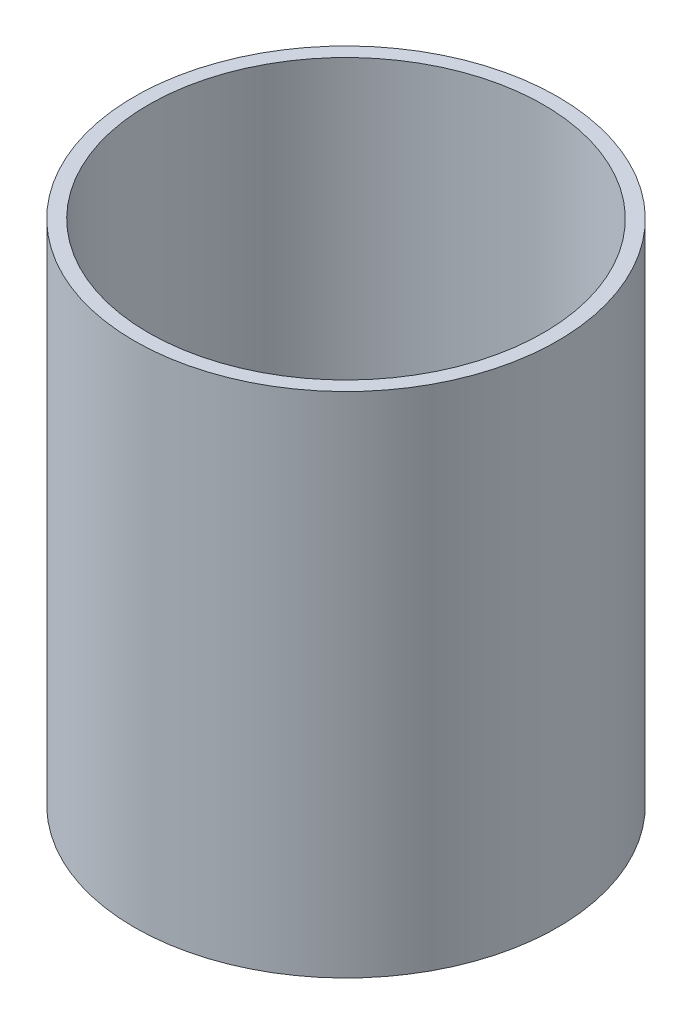
ISO-10303-21;
HEADER;
FILE_DESCRIPTION(('STEP AP214'),'2;1');
FILE_NAME('part.step','',(''),(''),'','','');
FILE_SCHEMA(('AUTOMOTIVE_DESIGN { 1 0 10303 214 1 1 1 1 }'));
ENDSEC;
DATA;
#1=APPLICATION_CONTEXT('core data for automotive mechanical design processes');
#2=APPLICATION_PROTOCOL_DEFINITION('international standard','automotive_design',2000,#1);
#3=PRODUCT_CONTEXT('',#1,'mechanical');
#4=PRODUCT('Part','Part','',(#3));
#5=PRODUCT_RELATED_PRODUCT_CATEGORY('part','',(#4));
#6=PRODUCT_DEFINITION_FORMATION('','',#4);
#7=PRODUCT_DEFINITION_CONTEXT('part definition',#1,'design');
#8=PRODUCT_DEFINITION('design','',#6,#7);
#9=PRODUCT_DEFINITION_SHAPE('','',#8);
#10=(LENGTH_UNIT() NAMED_UNIT(*) SI_UNIT(.MILLI.,.METRE.));
#11=(NAMED_UNIT(*) PLANE_ANGLE_UNIT() SI_UNIT($,.RADIAN.));
#12=(NAMED_UNIT(*) SI_UNIT($,.STERADIAN.) SOLID_ANGLE_UNIT());
#13=UNCERTAINTY_MEASURE_WITH_UNIT(LENGTH_MEASURE(1.E-05),#10,'distance_accuracy_value','');
#14=(GEOMETRIC_REPRESENTATION_CONTEXT(3) GLOBAL_UNCERTAINTY_ASSIGNED_CONTEXT((#13)) GLOBAL_UNIT_ASSIGNED_CONTEXT((#10,
#11,#12)) REPRESENTATION_CONTEXT('',''));
#15=CARTESIAN_POINT('',(0.,0.,0.));
#16=DIRECTION('',(0.,0.,1.));
#17=DIRECTION('',(1.,0.,0.));
#18=AXIS2_PLACEMENT_3D('',#15,#16,#17);
#19=CARTESIAN_POINT('',(0.,360.,0.));
#20=DIRECTION('',(0.,-1.,0.));
#21=DIRECTION('',(0.,0.,-1.));
#22=AXIS2_PLACEMENT_3D('',#19,#20,#21);
#23=CYLINDRICAL_SURFACE('',#22,150.);
#24=CARTESIAN_POINT('',(0.,360.,0.));
#25=DIRECTION('',(0.,1.,0.));
#26=DIRECTION('',(0.,0.,1.));
#27=AXIS2_PLACEMENT_3D('',#24,#25,#26);
#28=CIRCLE('',#27,150.);
#29=CARTESIAN_POINT('',(0.,360.,-150.));
#30=VERTEX_POINT('',#29);
#31=EDGE_CURVE('E10',#30,#30,#28,.T.);
#32=CARTESIAN_POINT('',(0.,0.,0.));
#33=DIRECTION('',(0.,1.,0.));
#34=DIRECTION('',(0.,0.,1.));
#35=AXIS2_PLACEMENT_3D('',#32,#33,#34);
#36=CIRCLE('',#35,150.);
#37=CARTESIAN_POINT('',(0.,0.,-150.));
#38=VERTEX_POINT('',#37);
#39=EDGE_CURVE('E40',#38,#38,#36,.T.);
#40=CARTESIAN_POINT('',(0.,360.,-150.));
#41=CARTESIAN_POINT('',(0.,356.25,-150.));
#42=CARTESIAN_POINT('',(0.,352.5,-150.));
#43=CARTESIAN_POINT('',(0.,345.,-150.));
#44=CARTESIAN_POINT('',(0.,341.25,-150.));
#45=CARTESIAN_POINT('',(0.,333.75,-150.));
#46=CARTESIAN_POINT('',(0.,330.,-150.));
#47=CARTESIAN_POINT('',(0.,322.5,-150.));
#48=CARTESIAN_POINT('',(0.,318.75,-150.));
#49=CARTESIAN_POINT('',(0.,311.25,-150.));
#50=CARTESIAN_POINT('',(0.,307.5,-150.));
#51=CARTESIAN_POINT('',(0.,300.,-150.));
#52=CARTESIAN_POINT('',(0.,296.25,-150.));
#53=CARTESIAN_POINT('',(0.,288.75,-150.));
#54=CARTESIAN_POINT('',(0.,285.,-150.));
#55=CARTESIAN_POINT('',(0.,277.5,-150.));
#56=CARTESIAN_POINT('',(0.,273.75,-150.));
#57=CARTESIAN_POINT('',(0.,266.25,-150.));
#58=CARTESIAN_POINT('',(0.,262.5,-150.));
#59=CARTESIAN_POINT('',(0.,255.,-150.));
#60=CARTESIAN_POINT('',(0.,251.25,-150.));
#61=CARTESIAN_POINT('',(0.,243.75,-150.));
#62=CARTESIAN_POINT('',(0.,240.,-150.));
#63=CARTESIAN_POINT('',(0.,232.5,-150.));
#64=CARTESIAN_POINT('',(0.,228.75,-150.));
#65=CARTESIAN_POINT('',(0.,221.25,-150.));
#66=CARTESIAN_POINT('',(0.,217.5,-150.));
#67=CARTESIAN_POINT('',(0.,210.,-150.));
#68=CARTESIAN_POINT('',(0.,206.25,-150.));
#69=CARTESIAN_POINT('',(0.,198.75,-150.));
#70=CARTESIAN_POINT('',(0.,195.,-150.));
#71=CARTESIAN_POINT('',(0.,187.5,-150.));
#72=CARTESIAN_POINT('',(0.,183.75,-150.));
#73=CARTESIAN_POINT('',(0.,176.25,-150.));
#74=CARTESIAN_POINT('',(0.,172.5,-150.));
#75=CARTESIAN_POINT('',(0.,165.,-150.));
#76=CARTESIAN_POINT('',(0.,161.25,-150.));
#77=CARTESIAN_POINT('',(0.,153.75,-150.));
#78=CARTESIAN_POINT('',(0.,150.,-150.));
#79=CARTESIAN_POINT('',(0.,142.5,-150.));
#80=CARTESIAN_POINT('',(0.,138.75,-150.));
#81=CARTESIAN_POINT('',(0.,131.25,-150.));
#82=CARTESIAN_POINT('',(0.,127.5,-150.));
#83=CARTESIAN_POINT('',(0.,120.,-150.));
#84=CARTESIAN_POINT('',(0.,116.25,-150.));
#85=CARTESIAN_POINT('',(0.,108.75,-150.));
#86=CARTESIAN_POINT('',(0.,105.,-150.));
#87=CARTESIAN_POINT('',(0.,97.5,-150.));
#88=CARTESIAN_POINT('',(0.,93.75,-150.));
#89=CARTESIAN_POINT('',(0.,86.25,-150.));
#90=CARTESIAN_POINT('',(0.,82.4999999999999,-150.));
#91=CARTESIAN_POINT('',(0.,74.9999999999999,-150.));
#92=CARTESIAN_POINT('',(0.,71.2499999999999,-150.));
#93=CARTESIAN_POINT('',(0.,63.75,-150.));
#94=CARTESIAN_POINT('',(0.,60.,-150.));
#95=CARTESIAN_POINT('',(0.,52.5,-150.));
#96=CARTESIAN_POINT('',(0.,48.7499999999999,-150.));
#97=CARTESIAN_POINT('',(0.,41.2499999999999,-150.));
#98=CARTESIAN_POINT('',(0.,37.4999999999999,-150.));
#99=CARTESIAN_POINT('',(0.,30.,-150.));
#100=CARTESIAN_POINT('',(0.,26.25,-150.));
#101=CARTESIAN_POINT('',(0.,18.75,-150.));
#102=CARTESIAN_POINT('',(0.,14.9999999999999,-150.));
#103=CARTESIAN_POINT('',(0.,7.49999999999993,-150.));
#104=CARTESIAN_POINT('',(0.,3.74999999999994,-150.));
#105=CARTESIAN_POINT('',(0.,0.,-150.));
#106=B_SPLINE_CURVE_WITH_KNOTS('',3,(#40,#41,#42,#43,#44,#45,#46,#47,#48,#49,#50,#51,#52,#53,
#54,#55,#56,#57,#58,#59,#60,#61,#62,#63,#64,#65,#66,#67,#68,#69,#70,#71,#72,#73,#74,#75,#76,#77,
#78,#79,#80,#81,#82,#83,#84,#85,#86,#87,#88,#89,#90,#91,#92,#93,#94,#95,#96,#97,#98,#99,#100,
#101,#102,#103,#104,#105),.UNSPECIFIED.,.F.,.F.,(4,2,2,2,2,2,2,2,2,2,2,2,2,2,2,2,2,2,2,2,2,2,2,
2,2,2,2,2,2,2,2,2,4),(0.,11.25,22.5,33.7499999999999,45.,56.25,67.4999999999999,78.75,90.,
101.25,112.5,123.75,135.,146.25,157.5,168.75,180.,191.25,202.5,213.75,225.,236.25,247.5,258.75,
270.,281.25,292.5,303.75,315.,326.25,337.5,348.75,360.),.UNSPECIFIED.);
#107=EDGE_CURVE('BSEAM37',#30,#38,#106,.T.);
#108=ORIENTED_EDGE('',*,*,#31,.F.);
#109=ORIENTED_EDGE('',*,*,#39,.T.);
#110=ORIENTED_EDGE('',*,*,#107,.T.);
#111=ORIENTED_EDGE('',*,*,#107,.F.);
#112=EDGE_LOOP('',(#108,#110,#109,#111));
#113=FACE_BOUND('',#112,.T.);
#114=ADVANCED_FACE('F37',(#113),#23,.T.);
#115=CARTESIAN_POINT('',(0.,360.,0.));
#116=DIRECTION('',(0.,1.,0.));
#117=DIRECTION('',(0.,0.,1.));
#118=AXIS2_PLACEMENT_3D('',#115,#116,#117);
#119=PLANE('',#118);
#120=CARTESIAN_POINT('',(0.,360.,0.));
#121=DIRECTION('',(0.,1.,0.));
#122=DIRECTION('',(0.,0.,1.));
#123=AXIS2_PLACEMENT_3D('',#120,#121,#122);
#124=CIRCLE('',#123,140.);
#125=CARTESIAN_POINT('',(0.,360.,140.));
#126=VERTEX_POINT('',#125);
#127=EDGE_CURVE('E49',#126,#126,#124,.T.);
#128=ORIENTED_EDGE('',*,*,#127,.F.);
#129=EDGE_LOOP('',(#128));
#130=FACE_BOUND('',#129,.T.);
#131=ORIENTED_EDGE('',*,*,#31,.T.);
#132=EDGE_LOOP('',(#131));
#133=FACE_BOUND('',#132,.T.);
#134=ADVANCED_FACE('F64',(#130,#133),#119,.T.);
#135=CARTESIAN_POINT('',(0.,0.,0.));
#136=DIRECTION('',(0.,1.,0.));
#137=DIRECTION('',(0.,0.,1.));
#138=AXIS2_PLACEMENT_3D('',#135,#136,#137);
#139=PLANE('',#138);
#140=ORIENTED_EDGE('',*,*,#39,.F.);
#141=EDGE_LOOP('',(#140));
#142=FACE_BOUND('',#141,.T.);
#143=ADVANCED_FACE('F60',(#142),#139,.F.);
#144=CARTESIAN_POINT('',(0.,10.,0.));
#145=DIRECTION('',(0.,1.,0.));
#146=DIRECTION('',(0.,0.,1.));
#147=AXIS2_PLACEMENT_3D('',#144,#145,#146);
#148=CYLINDRICAL_SURFACE('',#147,140.);
#149=CARTESIAN_POINT('',(0.,10.,0.));
#150=DIRECTION('',(0.,1.,0.));
#151=DIRECTION('',(0.,0.,1.));
#152=AXIS2_PLACEMENT_3D('',#149,#150,#151);
#153=CIRCLE('',#152,140.);
#154=CARTESIAN_POINT('',(0.,10.,140.));
#155=VERTEX_POINT('',#154);
#156=EDGE_CURVE('E47',#155,#155,#153,.T.);
#157=ORIENTED_EDGE('',*,*,#156,.F.);
#158=EDGE_LOOP('',(#157));
#159=FACE_BOUND('',#158,.T.);
#160=ORIENTED_EDGE('',*,*,#127,.T.);
#161=EDGE_LOOP('',(#160));
#162=FACE_BOUND('',#161,.T.);
#163=ADVANCED_FACE('F57',(#159,#162),#148,.F.);
#164=CARTESIAN_POINT('',(0.,10.,0.));
#165=DIRECTION('',(0.,1.,0.));
#166=DIRECTION('',(0.,0.,1.));
#167=AXIS2_PLACEMENT_3D('',#164,#165,#166);
#168=PLANE('',#167);
#169=ORIENTED_EDGE('',*,*,#156,.T.);
#170=EDGE_LOOP('',(#169));
#171=FACE_BOUND('',#170,.T.);
#172=ADVANCED_FACE('F55',(#171),#168,.T.);
#173=CLOSED_SHELL('',(#114,#134,#143,#163,#172));
#174=MANIFOLD_SOLID_BREP('B2',#173);
#175=ADVANCED_BREP_SHAPE_REPRESENTATION('',(#18,#174),#14);
#176=SHAPE_DEFINITION_REPRESENTATION(#9,#175);
ENDSEC;
END-ISO-10303-21;
